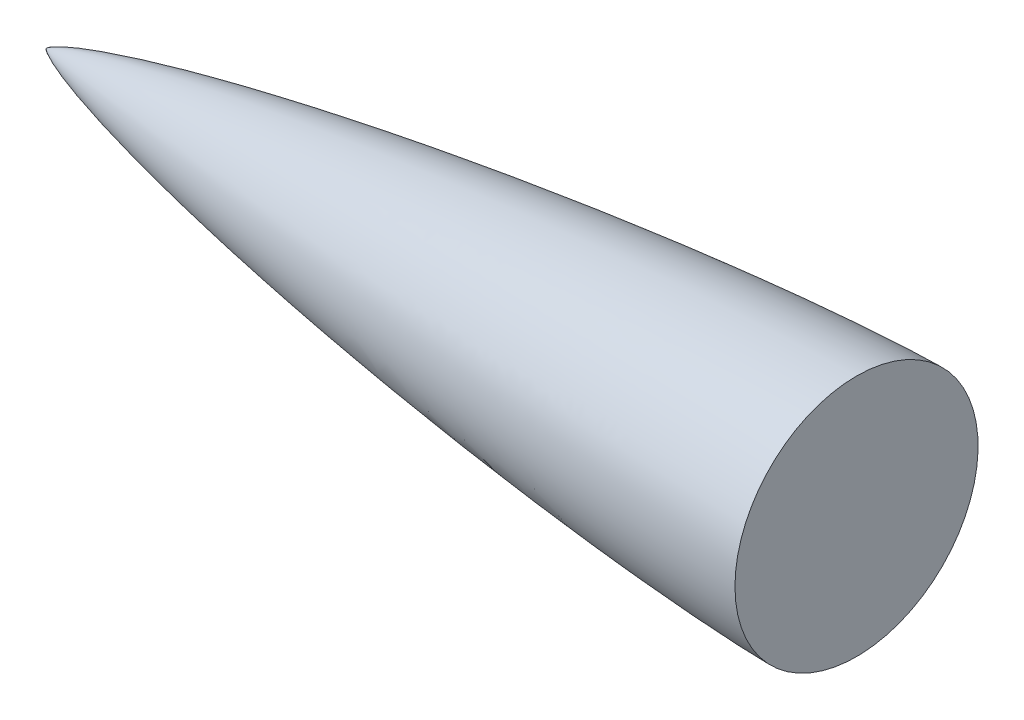
ISO-10303-21;
HEADER;
FILE_DESCRIPTION(('STEP AP214'),'2;1');
FILE_NAME('part.step','',(''),(''),'','','');
FILE_SCHEMA(('AUTOMOTIVE_DESIGN { 1 0 10303 214 1 1 1 1 }'));
ENDSEC;
DATA;
#1=APPLICATION_CONTEXT('core data for automotive mechanical design processes');
#2=APPLICATION_PROTOCOL_DEFINITION('international standard','automotive_design',2000,#1);
#3=PRODUCT_CONTEXT('',#1,'mechanical');
#4=PRODUCT('Part','Part','',(#3));
#5=PRODUCT_RELATED_PRODUCT_CATEGORY('part','',(#4));
#6=PRODUCT_DEFINITION_FORMATION('','',#4);
#7=PRODUCT_DEFINITION_CONTEXT('part definition',#1,'design');
#8=PRODUCT_DEFINITION('design','',#6,#7);
#9=PRODUCT_DEFINITION_SHAPE('','',#8);
#10=(LENGTH_UNIT() NAMED_UNIT(*) SI_UNIT(.MILLI.,.METRE.));
#11=(NAMED_UNIT(*) PLANE_ANGLE_UNIT() SI_UNIT($,.RADIAN.));
#12=(NAMED_UNIT(*) SI_UNIT($,.STERADIAN.) SOLID_ANGLE_UNIT());
#13=UNCERTAINTY_MEASURE_WITH_UNIT(LENGTH_MEASURE(1.E-05),#10,'distance_accuracy_value','');
#14=(GEOMETRIC_REPRESENTATION_CONTEXT(3) GLOBAL_UNCERTAINTY_ASSIGNED_CONTEXT((#13)) GLOBAL_UNIT_ASSIGNED_CONTEXT((#10,
#11,#12)) REPRESENTATION_CONTEXT('',''));
#15=CARTESIAN_POINT('',(0.,0.,0.));
#16=DIRECTION('',(0.,0.,1.));
#17=DIRECTION('',(1.,0.,0.));
#18=AXIS2_PLACEMENT_3D('',#15,#16,#17);
#19=CARTESIAN_POINT('',(20.,3.,0.));
#20=CARTESIAN_POINT('',(19.759290584091,2.99830941167968,0.));
#21=CARTESIAN_POINT('',(19.201836212494,2.98299021765689,0.));
#22=CARTESIAN_POINT('',(18.3281359400573,2.94391356842066,0.));
#23=CARTESIAN_POINT('',(17.1389907268648,2.86911806764175,0.));
#24=CARTESIAN_POINT('',(15.8751152548701,2.77119629659472,0.));
#25=CARTESIAN_POINT('',(14.612570361719,2.65737498617775,0.));
#26=CARTESIAN_POINT('',(13.3513909484743,2.52941432441142,0.));
#27=CARTESIAN_POINT('',(12.0916431969439,2.388034947687,0.));
#28=CARTESIAN_POINT('',(10.5188668592834,2.19508932258355,0.));
#29=CARTESIAN_POINT('',(8.94887440792545,1.98037424078738,0.));
#30=CARTESIAN_POINT('',(7.38214038645245,1.74293452698512,0.));
#31=CARTESIAN_POINT('',(5.81964419073298,1.47923317173538,0.));
#32=CARTESIAN_POINT('',(4.57285569256803,1.25004678224903,0.));
#33=CARTESIAN_POINT('',(3.34215305888889,1.00118411209754,0.));
#34=CARTESIAN_POINT('',(2.2721677970852,0.758399734455876,0.));
#35=CARTESIAN_POINT('',(1.41426788179724,0.536771084826612,0.));
#36=CARTESIAN_POINT('',(0.810826928841379,0.354992150603445,0.));
#37=CARTESIAN_POINT('',(0.471720747539876,0.237309671261004,0.));
#38=CARTESIAN_POINT('',(0.268152701926947,0.155534509569756,0.));
#39=CARTESIAN_POINT('',(0.154805144507881,0.102946824275105,0.));
#40=CARTESIAN_POINT('',(0.0926573908367695,0.0699921154234653,0.));
#41=CARTESIAN_POINT('',(0.0573167913210604,0.0487922555309402,0.));
#42=CARTESIAN_POINT('',(0.0364003323757366,0.0346577240390467,0.));
#43=CARTESIAN_POINT('',(0.0227909751434808,0.0244968487693284,0.));
#44=CARTESIAN_POINT('',(0.0122473203551213,0.015389267428812,0.));
#45=CARTESIAN_POINT('',(0.00516937661116515,0.00872474138320591,0.));
#46=CARTESIAN_POINT('',(0.00152191117554386,0.00327642462728621,0.));
#47=CARTESIAN_POINT('',(0.,0.,0.));
#48=B_SPLINE_CURVE_WITH_KNOTS('',4,(#19,#20,#21,#22,#23,#24,#25,#26,#27,#28,#29,#30,#31,#32,#33,
#34,#35,#36,#37,#38,#39,#40,#41,#42,#43,#44,#45,#46,#47),.UNSPECIFIED.,.F.,.F.,(5,1,1,1,1,1,1,1,
1,1,1,1,1,1,1,1,1,1,1,1,1,1,1,1,1,5),(0.,0.0474313730721893,0.109877547987741,0.172323723416681,
0.234769900121104,0.297216073556211,0.359662248910283,0.422108423884707,0.484554599365608,
0.609446948301889,0.671893123997519,0.734339297931479,0.796785468432099,0.859231646299098,
0.9192908135299,0.950513830207713,0.971341918143476,0.983386684200627,0.989997136802696,
0.993725107542949,0.99595175320143,0.997243318771063,0.998111805935774,0.998701124711282,
0.999290635267254,1.),.UNSPECIFIED.);
#49=CARTESIAN_POINT('',(0.,0.,0.));
#50=DIRECTION('',(-1.,0.,0.));
#51=AXIS1_PLACEMENT('',#49,#50);
#52=SURFACE_OF_REVOLUTION('',#48,#51);
#53=CARTESIAN_POINT('',(0.,0.,0.));
#54=VERTEX_POINT('',#53);
#55=VERTEX_LOOP('',#54);
#56=FACE_BOUND('',#55,.T.);
#57=CARTESIAN_POINT('',(20.,0.,0.));
#58=DIRECTION('',(-1.,0.,0.));
#59=DIRECTION('',(0.,0.,1.));
#60=AXIS2_PLACEMENT_3D('',#57,#58,#59);
#61=CIRCLE('',#60,3.);
#62=CARTESIAN_POINT('',(20.,0.,3.));
#63=VERTEX_POINT('',#62);
#64=EDGE_CURVE('E11',#63,#63,#61,.T.);
#65=ORIENTED_EDGE('',*,*,#64,.T.);
#66=EDGE_LOOP('',(#65));
#67=FACE_BOUND('',#66,.T.);
#68=ADVANCED_FACE('F39',(#56,#67),#52,.T.);
#69=CARTESIAN_POINT('',(20.,0.,0.));
#70=DIRECTION('',(-1.,0.,0.));
#71=DIRECTION('',(0.,0.,1.));
#72=AXIS2_PLACEMENT_3D('',#69,#70,#71);
#73=PLANE('',#72);
#74=ORIENTED_EDGE('',*,*,#64,.F.);
#75=EDGE_LOOP('',(#74));
#76=FACE_BOUND('',#75,.T.);
#77=ADVANCED_FACE('F50',(#76),#73,.F.);
#78=CLOSED_SHELL('',(#68,#77));
#79=MANIFOLD_SOLID_BREP('B2',#78);
#80=ADVANCED_BREP_SHAPE_REPRESENTATION('',(#18,#79),#14);
#81=SHAPE_DEFINITION_REPRESENTATION(#9,#80);
ENDSEC;
END-ISO-10303-21;
